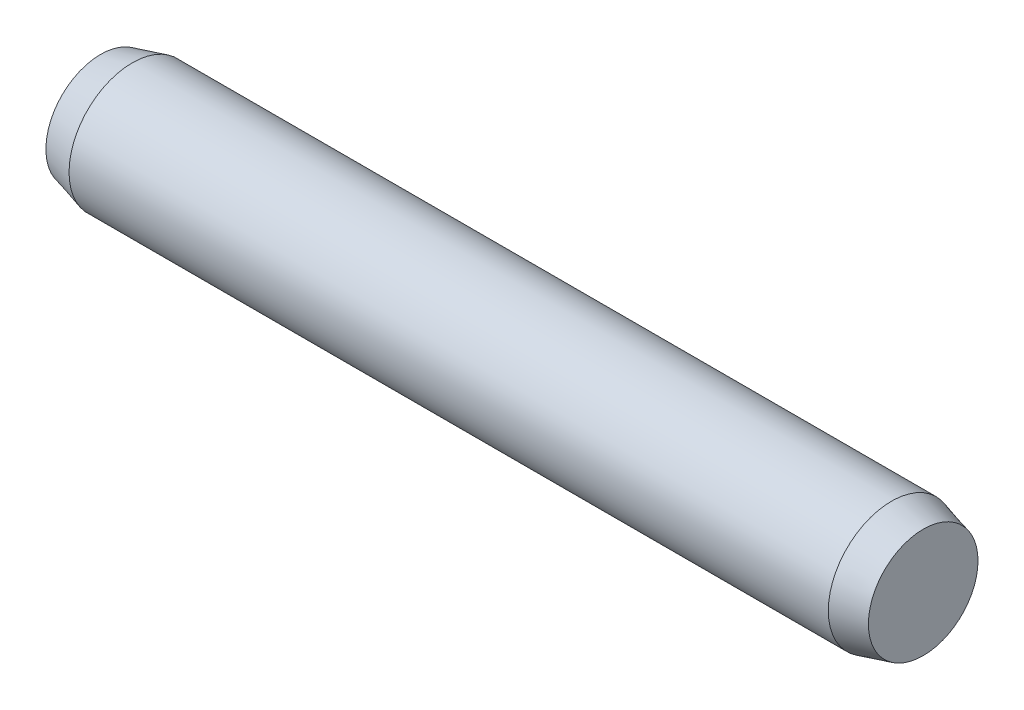
ISO-10303-21;
HEADER;
FILE_DESCRIPTION(('STEP AP214'),'2;1');
FILE_NAME('part.step','',(''),(''),'','','');
FILE_SCHEMA(('AUTOMOTIVE_DESIGN { 1 0 10303 214 1 1 1 1 }'));
ENDSEC;
DATA;
#1=APPLICATION_CONTEXT('core data for automotive mechanical design processes');
#2=APPLICATION_PROTOCOL_DEFINITION('international standard','automotive_design',2000,#1);
#3=PRODUCT_CONTEXT('',#1,'mechanical');
#4=PRODUCT('Part','Part','',(#3));
#5=PRODUCT_RELATED_PRODUCT_CATEGORY('part','',(#4));
#6=PRODUCT_DEFINITION_FORMATION('','',#4);
#7=PRODUCT_DEFINITION_CONTEXT('part definition',#1,'design');
#8=PRODUCT_DEFINITION('design','',#6,#7);
#9=PRODUCT_DEFINITION_SHAPE('','',#8);
#10=(LENGTH_UNIT() NAMED_UNIT(*) SI_UNIT(.MILLI.,.METRE.));
#11=(NAMED_UNIT(*) PLANE_ANGLE_UNIT() SI_UNIT($,.RADIAN.));
#12=(NAMED_UNIT(*) SI_UNIT($,.STERADIAN.) SOLID_ANGLE_UNIT());
#13=UNCERTAINTY_MEASURE_WITH_UNIT(LENGTH_MEASURE(1.E-05),#10,'distance_accuracy_value','');
#14=(GEOMETRIC_REPRESENTATION_CONTEXT(3) GLOBAL_UNCERTAINTY_ASSIGNED_CONTEXT((#13)) GLOBAL_UNIT_ASSIGNED_CONTEXT((#10,
#11,#12)) REPRESENTATION_CONTEXT('',''));
#15=CARTESIAN_POINT('',(0.,0.,0.));
#16=DIRECTION('',(0.,0.,1.));
#17=DIRECTION('',(1.,0.,0.));
#18=AXIS2_PLACEMENT_3D('',#15,#16,#17);
#19=CARTESIAN_POINT('',(26.,0.,0.));
#20=DIRECTION('',(-1.,0.,0.));
#21=DIRECTION('',(0.,0.,1.));
#22=AXIS2_PLACEMENT_3D('',#19,#20,#21);
#23=CYLINDRICAL_SURFACE('',#22,2.);
#24=CARTESIAN_POINT('',(0.99999999999999,0.,0.));
#25=DIRECTION('',(1.,0.,0.));
#26=DIRECTION('',(0.,0.,-1.));
#27=AXIS2_PLACEMENT_3D('',#24,#25,#26);
#28=CIRCLE('',#27,2.);
#29=CARTESIAN_POINT('',(0.999999999999987,0.,2.));
#30=VERTEX_POINT('',#29);
#31=EDGE_CURVE('E59',#30,#30,#28,.T.);
#32=CARTESIAN_POINT('',(25.0000000000001,0.,0.));
#33=DIRECTION('',(1.,0.,0.));
#34=DIRECTION('',(0.,0.,-1.));
#35=AXIS2_PLACEMENT_3D('',#32,#33,#34);
#36=CIRCLE('',#35,2.);
#37=CARTESIAN_POINT('',(25.0000000000001,0.,2.));
#38=VERTEX_POINT('',#37);
#39=EDGE_CURVE('E64',#38,#38,#36,.F.);
#40=CARTESIAN_POINT('',(0.999999999999987,0.,2.));
#41=CARTESIAN_POINT('',(1.24999999999999,0.,2.));
#42=CARTESIAN_POINT('',(1.49999999999999,0.,2.));
#43=CARTESIAN_POINT('',(1.99999999999999,0.,2.));
#44=CARTESIAN_POINT('',(2.24999999999999,0.,2.));
#45=CARTESIAN_POINT('',(2.75,0.,2.));
#46=CARTESIAN_POINT('',(3.,0.,2.));
#47=CARTESIAN_POINT('',(3.5,0.,2.));
#48=CARTESIAN_POINT('',(3.75,0.,2.));
#49=CARTESIAN_POINT('',(4.25,0.,2.));
#50=CARTESIAN_POINT('',(4.5,0.,2.));
#51=CARTESIAN_POINT('',(5.00000000000001,0.,2.));
#52=CARTESIAN_POINT('',(5.25000000000001,0.,2.));
#53=CARTESIAN_POINT('',(5.75000000000001,0.,2.));
#54=CARTESIAN_POINT('',(6.00000000000001,0.,2.));
#55=CARTESIAN_POINT('',(6.50000000000001,0.,2.));
#56=CARTESIAN_POINT('',(6.75000000000001,0.,2.));
#57=CARTESIAN_POINT('',(7.25000000000001,0.,2.));
#58=CARTESIAN_POINT('',(7.50000000000002,0.,2.));
#59=CARTESIAN_POINT('',(8.00000000000002,0.,2.));
#60=CARTESIAN_POINT('',(8.25000000000002,0.,2.));
#61=CARTESIAN_POINT('',(8.75000000000002,0.,2.));
#62=CARTESIAN_POINT('',(9.00000000000002,0.,2.));
#63=CARTESIAN_POINT('',(9.50000000000003,0.,2.));
#64=CARTESIAN_POINT('',(9.75000000000003,0.,2.));
#65=CARTESIAN_POINT('',(10.25,0.,2.));
#66=CARTESIAN_POINT('',(10.5,0.,2.));
#67=CARTESIAN_POINT('',(11.,0.,2.));
#68=CARTESIAN_POINT('',(11.25,0.,2.));
#69=CARTESIAN_POINT('',(11.75,0.,2.));
#70=CARTESIAN_POINT('',(12.,0.,2.));
#71=CARTESIAN_POINT('',(12.5,0.,2.));
#72=CARTESIAN_POINT('',(12.75,0.,2.));
#73=CARTESIAN_POINT('',(13.25,0.,2.));
#74=CARTESIAN_POINT('',(13.5,0.,2.));
#75=CARTESIAN_POINT('',(14.,0.,2.));
#76=CARTESIAN_POINT('',(14.25,0.,2.));
#77=CARTESIAN_POINT('',(14.75,0.,2.));
#78=CARTESIAN_POINT('',(15.,0.,2.));
#79=CARTESIAN_POINT('',(15.5000000000001,0.,2.));
#80=CARTESIAN_POINT('',(15.7500000000001,0.,2.));
#81=CARTESIAN_POINT('',(16.2500000000001,0.,2.));
#82=CARTESIAN_POINT('',(16.5000000000001,0.,2.));
#83=CARTESIAN_POINT('',(17.0000000000001,0.,2.));
#84=CARTESIAN_POINT('',(17.2500000000001,0.,2.));
#85=CARTESIAN_POINT('',(17.7500000000001,0.,2.));
#86=CARTESIAN_POINT('',(18.0000000000001,0.,2.));
#87=CARTESIAN_POINT('',(18.5000000000001,0.,2.));
#88=CARTESIAN_POINT('',(18.7500000000001,0.,2.));
#89=CARTESIAN_POINT('',(19.2500000000001,0.,2.));
#90=CARTESIAN_POINT('',(19.5000000000001,0.,2.));
#91=CARTESIAN_POINT('',(20.0000000000001,0.,2.));
#92=CARTESIAN_POINT('',(20.2500000000001,0.,2.));
#93=CARTESIAN_POINT('',(20.7500000000001,0.,2.));
#94=CARTESIAN_POINT('',(21.0000000000001,0.,2.));
#95=CARTESIAN_POINT('',(21.5000000000001,0.,2.));
#96=CARTESIAN_POINT('',(21.7500000000001,0.,2.));
#97=CARTESIAN_POINT('',(22.2500000000001,0.,2.));
#98=CARTESIAN_POINT('',(22.5000000000001,0.,2.));
#99=CARTESIAN_POINT('',(23.0000000000001,0.,2.));
#100=CARTESIAN_POINT('',(23.2500000000001,0.,2.));
#101=CARTESIAN_POINT('',(23.7500000000001,0.,2.));
#102=CARTESIAN_POINT('',(24.0000000000001,0.,2.));
#103=CARTESIAN_POINT('',(24.5000000000001,0.,2.));
#104=CARTESIAN_POINT('',(24.7500000000001,0.,2.));
#105=CARTESIAN_POINT('',(25.0000000000001,0.,2.));
#106=B_SPLINE_CURVE_WITH_KNOTS('',3,(#40,#41,#42,#43,#44,#45,#46,#47,#48,#49,#50,#51,#52,#53,
#54,#55,#56,#57,#58,#59,#60,#61,#62,#63,#64,#65,#66,#67,#68,#69,#70,#71,#72,#73,#74,#75,#76,#77,
#78,#79,#80,#81,#82,#83,#84,#85,#86,#87,#88,#89,#90,#91,#92,#93,#94,#95,#96,#97,#98,#99,#100,
#101,#102,#103,#104,#105),.UNSPECIFIED.,.F.,.F.,(4,2,2,2,2,2,2,2,2,2,2,2,2,2,2,2,2,2,2,2,2,2,2,
2,2,2,2,2,2,2,2,2,4),(0.,0.750000000000004,1.50000000000001,2.25000000000001,3.00000000000001,
3.75000000000002,4.50000000000002,5.25000000000003,6.00000000000003,6.75000000000003,
7.50000000000003,8.25000000000004,9.00000000000004,9.75000000000004,10.5,11.25,12.0000000000001,
12.7500000000001,13.5000000000001,14.2500000000001,15.0000000000001,15.7500000000001,
16.5000000000001,17.2500000000001,18.0000000000001,18.7500000000001,19.5000000000001,
20.2500000000001,21.0000000000001,21.7500000000001,22.5000000000001,23.2500000000001,
24.0000000000001),.UNSPECIFIED.);
#107=EDGE_CURVE('BSEAM45',#30,#38,#106,.T.);
#108=ORIENTED_EDGE('',*,*,#31,.T.);
#109=ORIENTED_EDGE('',*,*,#39,.T.);
#110=ORIENTED_EDGE('',*,*,#107,.T.);
#111=ORIENTED_EDGE('',*,*,#107,.F.);
#112=EDGE_LOOP('',(#108,#110,#109,#111));
#113=FACE_BOUND('',#112,.T.);
#114=ADVANCED_FACE('F45',(#113),#23,.T.);
#115=CARTESIAN_POINT('',(26.,0.,0.));
#116=DIRECTION('',(1.,0.,0.));
#117=DIRECTION('',(0.,0.,-1.));
#118=AXIS2_PLACEMENT_3D('',#115,#116,#117);
#119=PLANE('',#118);
#120=CARTESIAN_POINT('',(26.,0.,0.));
#121=DIRECTION('',(1.,0.,0.));
#122=DIRECTION('',(0.,0.,-1.));
#123=AXIS2_PLACEMENT_3D('',#120,#121,#122);
#124=CIRCLE('',#123,1.73205080756891);
#125=CARTESIAN_POINT('',(26.,0.,-1.73205080756891));
#126=VERTEX_POINT('',#125);
#127=EDGE_CURVE('E10',#126,#126,#124,.T.);
#128=ORIENTED_EDGE('',*,*,#127,.T.);
#129=EDGE_LOOP('',(#128));
#130=FACE_BOUND('',#129,.T.);
#131=ADVANCED_FACE('F81',(#130),#119,.T.);
#132=CARTESIAN_POINT('',(0.,0.,0.));
#133=DIRECTION('',(1.,0.,0.));
#134=DIRECTION('',(0.,0.,-1.));
#135=AXIS2_PLACEMENT_3D('',#132,#133,#134);
#136=PLANE('',#135);
#137=CARTESIAN_POINT('',(0.,0.,0.));
#138=DIRECTION('',(1.,0.,0.));
#139=DIRECTION('',(0.,0.,-1.));
#140=AXIS2_PLACEMENT_3D('',#137,#138,#139);
#141=CIRCLE('',#140,1.73205080756888);
#142=CARTESIAN_POINT('',(0.,0.,-1.73205080756888));
#143=VERTEX_POINT('',#142);
#144=EDGE_CURVE('E54',#143,#143,#141,.F.);
#145=ORIENTED_EDGE('',*,*,#144,.T.);
#146=EDGE_LOOP('',(#145));
#147=FACE_BOUND('',#146,.T.);
#148=ADVANCED_FACE('F78',(#147),#136,.F.);
#149=CARTESIAN_POINT('',(0.99999999999999,0.,0.));
#150=DIRECTION('',(1.,0.,0.));
#151=DIRECTION('',(0.,0.,-1.));
#152=AXIS2_PLACEMENT_3D('',#149,#150,#151);
#153=CONICAL_SURFACE('',#152,2.,0.26179938779915);
#154=ORIENTED_EDGE('',*,*,#144,.F.);
#155=EDGE_LOOP('',(#154));
#156=FACE_BOUND('',#155,.T.);
#157=ORIENTED_EDGE('',*,*,#31,.F.);
#158=EDGE_LOOP('',(#157));
#159=FACE_BOUND('',#158,.T.);
#160=ADVANCED_FACE('F74',(#156,#159),#153,.T.);
#161=CARTESIAN_POINT('',(26.,0.,0.));
#162=DIRECTION('',(-1.,0.,0.));
#163=DIRECTION('',(0.,0.,1.));
#164=AXIS2_PLACEMENT_3D('',#161,#162,#163);
#165=CONICAL_SURFACE('',#164,1.73205080756891,0.261799387799147);
#166=ORIENTED_EDGE('',*,*,#39,.F.);
#167=EDGE_LOOP('',(#166));
#168=FACE_BOUND('',#167,.T.);
#169=ORIENTED_EDGE('',*,*,#127,.F.);
#170=EDGE_LOOP('',(#169));
#171=FACE_BOUND('',#170,.T.);
#172=ADVANCED_FACE('F48',(#168,#171),#165,.T.);
#173=CLOSED_SHELL('',(#114,#131,#148,#160,#172));
#174=MANIFOLD_SOLID_BREP('B2',#173);
#175=ADVANCED_BREP_SHAPE_REPRESENTATION('',(#18,#174),#14);
#176=SHAPE_DEFINITION_REPRESENTATION(#9,#175);
ENDSEC;
END-ISO-10303-21;
